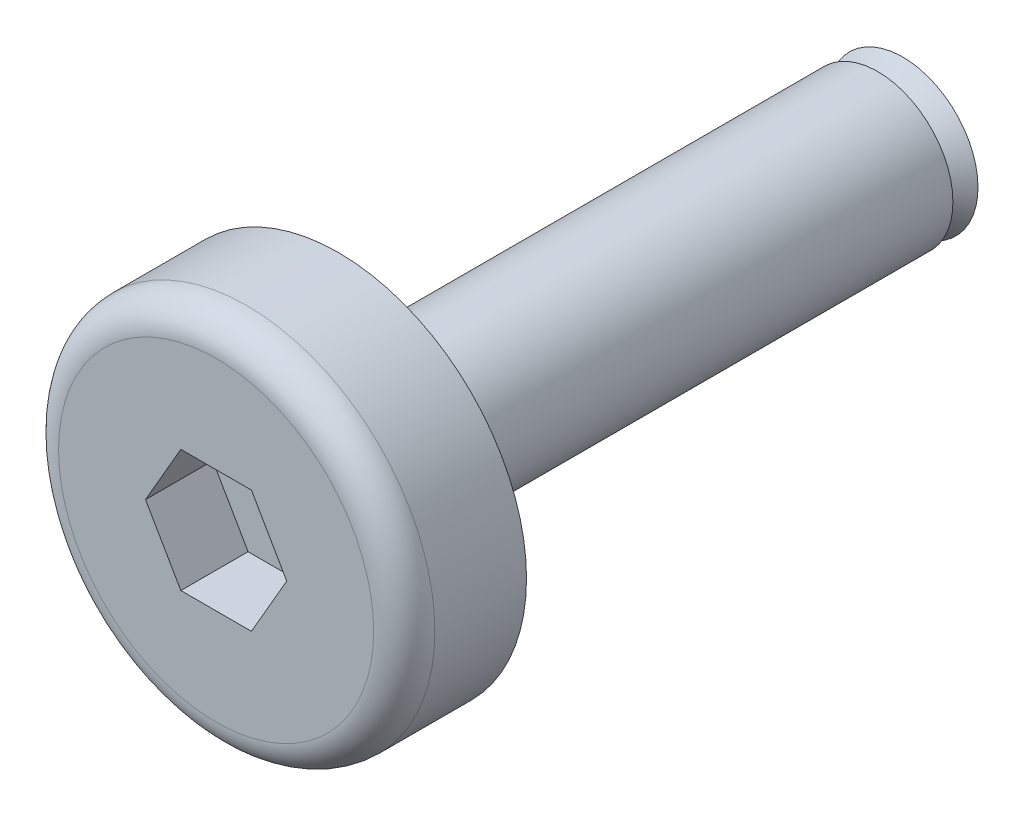
ISO-10303-21;
HEADER;
FILE_DESCRIPTION(('STEP AP214'),'2;1');
FILE_NAME('part.step','',(''),(''),'','','');
FILE_SCHEMA(('AUTOMOTIVE_DESIGN { 1 0 10303 214 1 1 1 1 }'));
ENDSEC;
DATA;
#1=APPLICATION_CONTEXT('core data for automotive mechanical design processes');
#2=APPLICATION_PROTOCOL_DEFINITION('international standard','automotive_design',2000,#1);
#3=PRODUCT_CONTEXT('',#1,'mechanical');
#4=PRODUCT('Part','Part','',(#3));
#5=PRODUCT_RELATED_PRODUCT_CATEGORY('part','',(#4));
#6=PRODUCT_DEFINITION_FORMATION('','',#4);
#7=PRODUCT_DEFINITION_CONTEXT('part definition',#1,'design');
#8=PRODUCT_DEFINITION('design','',#6,#7);
#9=PRODUCT_DEFINITION_SHAPE('','',#8);
#10=(LENGTH_UNIT() NAMED_UNIT(*) SI_UNIT(.MILLI.,.METRE.));
#11=(NAMED_UNIT(*) PLANE_ANGLE_UNIT() SI_UNIT($,.RADIAN.));
#12=(NAMED_UNIT(*) SI_UNIT($,.STERADIAN.) SOLID_ANGLE_UNIT());
#13=UNCERTAINTY_MEASURE_WITH_UNIT(LENGTH_MEASURE(1.E-05),#10,'distance_accuracy_value','');
#14=(GEOMETRIC_REPRESENTATION_CONTEXT(3) GLOBAL_UNCERTAINTY_ASSIGNED_CONTEXT((#13)) GLOBAL_UNIT_ASSIGNED_CONTEXT((#10,
#11,#12)) REPRESENTATION_CONTEXT('',''));
#15=CARTESIAN_POINT('',(0.,0.,0.));
#16=DIRECTION('',(0.,0.,1.));
#17=DIRECTION('',(1.,0.,0.));
#18=AXIS2_PLACEMENT_3D('',#15,#16,#17);
#19=CARTESIAN_POINT('',(0.,0.,-6.));
#20=DIRECTION('',(0.,0.,1.));
#21=DIRECTION('',(1.,0.,0.));
#22=AXIS2_PLACEMENT_3D('',#19,#20,#21);
#23=PLANE('',#22);
#24=CARTESIAN_POINT('',(0.,0.,-6.));
#25=DIRECTION('',(0.,0.,1.));
#26=DIRECTION('',(1.,0.,0.));
#27=AXIS2_PLACEMENT_3D('',#24,#25,#26);
#28=CIRCLE('',#27,0.8);
#29=CARTESIAN_POINT('',(0.8,0.,-6.));
#30=VERTEX_POINT('',#29);
#31=EDGE_CURVE('E9',#30,#30,#28,.T.);
#32=ORIENTED_EDGE('',*,*,#31,.F.);
#33=EDGE_LOOP('',(#32));
#34=FACE_BOUND('',#33,.T.);
#35=ADVANCED_FACE('F14',(#34),#23,.F.);
#36=CARTESIAN_POINT('',(0.,0.,-6.));
#37=DIRECTION('',(0.,0.,-1.));
#38=DIRECTION('',(1.,0.,0.));
#39=AXIS2_PLACEMENT_3D('',#36,#37,#38);
#40=CONICAL_SURFACE('',#39,0.8,0.785398163397);
#41=CARTESIAN_POINT('',(0.,0.,-5.733333333333));
#42=DIRECTION('',(0.,0.,1.));
#43=DIRECTION('',(1.,0.,0.));
#44=AXIS2_PLACEMENT_3D('',#41,#42,#43);
#45=CIRCLE('',#44,0.533333333333);
#46=CARTESIAN_POINT('',(0.533333333333,0.,-5.733333333333));
#47=VERTEX_POINT('',#46);
#48=EDGE_CURVE('E165',#47,#47,#45,.T.);
#49=ORIENTED_EDGE('',*,*,#48,.F.);
#50=DIRECTION('',(-0.707106781186548,0.,0.707106781186548));
#51=VECTOR('',#50,1.);
#52=CARTESIAN_POINT('',(0.8,0.,-6.));
#53=LINE('',#52,#51);
#54=EDGE_CURVE('E25',#30,#47,#53,.T.);
#55=ORIENTED_EDGE('',*,*,#54,.F.);
#56=ORIENTED_EDGE('',*,*,#31,.T.);
#57=ORIENTED_EDGE('',*,*,#54,.T.);
#58=EDGE_LOOP('',(#49,#55,#56,#57));
#59=FACE_BOUND('',#58,.T.);
#60=ADVANCED_FACE('F229',(#59),#40,.T.);
#61=CARTESIAN_POINT('',(0.,0.,0.585));
#62=DIRECTION('',(0.,0.,1.));
#63=DIRECTION('',(1.,0.,0.));
#64=AXIS2_PLACEMENT_3D('',#61,#62,#63);
#65=PLANE('',#64);
#66=DIRECTION('',(-0.50000000000019,0.866025403784329,0.));
#67=VECTOR('',#66,1.);
#68=CARTESIAN_POINT('',(0.750555349947,0.,0.585));
#69=LINE('',#68,#67);
#70=CARTESIAN_POINT('',(0.750555349947,0.,0.585));
#71=VERTEX_POINT('',#70);
#72=CARTESIAN_POINT('',(0.375277674973,0.65,0.585));
#73=VERTEX_POINT('',#72);
#74=EDGE_CURVE('E130',#71,#73,#69,.T.);
#75=ORIENTED_EDGE('',*,*,#74,.T.);
#76=DIRECTION('',(-1.,0.,0.));
#77=VECTOR('',#76,1.);
#78=CARTESIAN_POINT('',(0.375277674973,0.65,0.585));
#79=LINE('',#78,#77);
#80=CARTESIAN_POINT('',(-0.375277674973,0.65,0.585));
#81=VERTEX_POINT('',#80);
#82=EDGE_CURVE('E122',#73,#81,#79,.T.);
#83=ORIENTED_EDGE('',*,*,#82,.T.);
#84=DIRECTION('',(-0.50000000000019,-0.866025403784329,0.));
#85=VECTOR('',#84,1.);
#86=CARTESIAN_POINT('',(-0.375277674973,0.65,0.585));
#87=LINE('',#86,#85);
#88=CARTESIAN_POINT('',(-0.750555349947,0.,0.585));
#89=VERTEX_POINT('',#88);
#90=EDGE_CURVE('E107',#81,#89,#87,.T.);
#91=ORIENTED_EDGE('',*,*,#90,.T.);
#92=DIRECTION('',(0.50000000000019,-0.866025403784329,0.));
#93=VECTOR('',#92,1.);
#94=CARTESIAN_POINT('',(-0.750555349947,0.,0.585));
#95=LINE('',#94,#93);
#96=CARTESIAN_POINT('',(-0.375277674973,-0.65,0.585));
#97=VERTEX_POINT('',#96);
#98=EDGE_CURVE('E191',#89,#97,#95,.T.);
#99=ORIENTED_EDGE('',*,*,#98,.T.);
#100=DIRECTION('',(1.,0.,0.));
#101=VECTOR('',#100,1.);
#102=CARTESIAN_POINT('',(-0.375277674973,-0.65,0.585));
#103=LINE('',#102,#101);
#104=CARTESIAN_POINT('',(0.375277674973,-0.65,0.585));
#105=VERTEX_POINT('',#104);
#106=EDGE_CURVE('E180',#97,#105,#103,.T.);
#107=ORIENTED_EDGE('',*,*,#106,.T.);
#108=DIRECTION('',(0.50000000000019,0.866025403784329,0.));
#109=VECTOR('',#108,1.);
#110=CARTESIAN_POINT('',(0.375277674973,-0.65,0.585));
#111=LINE('',#110,#109);
#112=EDGE_CURVE('E175',#105,#71,#111,.T.);
#113=ORIENTED_EDGE('',*,*,#112,.T.);
#114=EDGE_LOOP('',(#75,#83,#91,#99,#107,#113));
#115=FACE_BOUND('',#114,.T.);
#116=ADVANCED_FACE('F128',(#115),#65,.T.);
#117=CARTESIAN_POINT('',(0.,0.,-5.733333333333));
#118=DIRECTION('',(0.,0.,1.));
#119=DIRECTION('',(1.,0.,0.));
#120=AXIS2_PLACEMENT_3D('',#117,#118,#119);
#121=PLANE('',#120);
#122=ORIENTED_EDGE('',*,*,#48,.T.);
#123=EDGE_LOOP('',(#122));
#124=FACE_BOUND('',#123,.T.);
#125=CARTESIAN_POINT('',(0.,0.,-5.733333333333));
#126=DIRECTION('',(0.,0.,1.));
#127=DIRECTION('',(1.,0.,0.));
#128=AXIS2_PLACEMENT_3D('',#125,#126,#127);
#129=CIRCLE('',#128,0.8);
#130=CARTESIAN_POINT('',(0.8,0.,-5.733333333333));
#131=VERTEX_POINT('',#130);
#132=EDGE_CURVE('E133',#131,#131,#129,.T.);
#133=ORIENTED_EDGE('',*,*,#132,.F.);
#134=EDGE_LOOP('',(#133));
#135=FACE_BOUND('',#134,.T.);
#136=ADVANCED_FACE('F217',(#124,#135),#121,.F.);
#137=CARTESIAN_POINT('',(0.750555349947,0.,0.585));
#138=DIRECTION('',(-0.866025403784329,-0.50000000000019,0.));
#139=DIRECTION('',(-0.50000000000019,0.866025403784329,0.));
#140=AXIS2_PLACEMENT_3D('',#137,#138,#139);
#141=PLANE('',#140);
#142=ORIENTED_EDGE('',*,*,#74,.F.);
#143=DIRECTION('',(0.,0.,1.));
#144=VECTOR('',#143,1.);
#145=CARTESIAN_POINT('',(0.750555349947,0.,0.585));
#146=LINE('',#145,#144);
#147=CARTESIAN_POINT('',(0.750555349947,0.,1.3));
#148=VERTEX_POINT('',#147);
#149=EDGE_CURVE('E173',#71,#148,#146,.T.);
#150=ORIENTED_EDGE('',*,*,#149,.T.);
#151=DIRECTION('',(0.50000000000019,-0.866025403784329,0.));
#152=VECTOR('',#151,1.);
#153=CARTESIAN_POINT('',(0.656735931203,0.1625,1.3));
#154=LINE('',#153,#152);
#155=CARTESIAN_POINT('',(0.375277674973,0.65,1.3));
#156=VERTEX_POINT('',#155);
#157=EDGE_CURVE('E158',#156,#148,#154,.T.);
#158=ORIENTED_EDGE('',*,*,#157,.F.);
#159=DIRECTION('',(0.,0.,1.));
#160=VECTOR('',#159,1.);
#161=CARTESIAN_POINT('',(0.375277674973,0.65,0.585));
#162=LINE('',#161,#160);
#163=EDGE_CURVE('E126',#73,#156,#162,.T.);
#164=ORIENTED_EDGE('',*,*,#163,.F.);
#165=EDGE_LOOP('',(#142,#150,#158,#164));
#166=FACE_BOUND('',#165,.T.);
#167=ADVANCED_FACE('F219',(#166),#141,.T.);
#168=CARTESIAN_POINT('',(0.375277674973,-0.65,0.585));
#169=DIRECTION('',(-0.866025403784329,0.50000000000019,0.));
#170=DIRECTION('',(0.,0.,1.));
#171=AXIS2_PLACEMENT_3D('',#168,#169,#170);
#172=PLANE('',#171);
#173=ORIENTED_EDGE('',*,*,#112,.F.);
#174=DIRECTION('',(0.,0.,1.));
#175=VECTOR('',#174,1.);
#176=CARTESIAN_POINT('',(0.375277674973,-0.65,0.585));
#177=LINE('',#176,#175);
#178=CARTESIAN_POINT('',(0.375277674973,-0.65,1.3));
#179=VERTEX_POINT('',#178);
#180=EDGE_CURVE('E184',#105,#179,#177,.T.);
#181=ORIENTED_EDGE('',*,*,#180,.T.);
#182=DIRECTION('',(-0.50000000000019,-0.866025403784329,0.));
#183=VECTOR('',#182,1.);
#184=CARTESIAN_POINT('',(0.469097093717,-0.4875,1.3));
#185=LINE('',#184,#183);
#186=EDGE_CURVE('E153',#148,#179,#185,.T.);
#187=ORIENTED_EDGE('',*,*,#186,.F.);
#188=ORIENTED_EDGE('',*,*,#149,.F.);
#189=EDGE_LOOP('',(#173,#181,#187,#188));
#190=FACE_BOUND('',#189,.T.);
#191=ADVANCED_FACE('F226',(#190),#172,.T.);
#192=CARTESIAN_POINT('',(-0.375277674973,-0.65,0.585));
#193=DIRECTION('',(0.,1.,0.));
#194=DIRECTION('',(1.,0.,0.));
#195=AXIS2_PLACEMENT_3D('',#192,#193,#194);
#196=PLANE('',#195);
#197=ORIENTED_EDGE('',*,*,#106,.F.);
#198=DIRECTION('',(0.,0.,1.));
#199=VECTOR('',#198,1.);
#200=CARTESIAN_POINT('',(-0.375277674973,-0.65,0.585));
#201=LINE('',#200,#199);
#202=CARTESIAN_POINT('',(-0.375277674973,-0.65,1.3));
#203=VERTEX_POINT('',#202);
#204=EDGE_CURVE('E185',#97,#203,#201,.T.);
#205=ORIENTED_EDGE('',*,*,#204,.T.);
#206=DIRECTION('',(-1.,0.,0.));
#207=VECTOR('',#206,1.);
#208=CARTESIAN_POINT('',(-0.187638837487,-0.65,1.3));
#209=LINE('',#208,#207);
#210=EDGE_CURVE('E157',#179,#203,#209,.T.);
#211=ORIENTED_EDGE('',*,*,#210,.F.);
#212=ORIENTED_EDGE('',*,*,#180,.F.);
#213=EDGE_LOOP('',(#197,#205,#211,#212));
#214=FACE_BOUND('',#213,.T.);
#215=ADVANCED_FACE('F245',(#214),#196,.T.);
#216=CARTESIAN_POINT('',(-0.750555349947,0.,0.585));
#217=DIRECTION('',(0.866025403784329,0.50000000000019,0.));
#218=DIRECTION('',(0.,0.,-1.));
#219=AXIS2_PLACEMENT_3D('',#216,#217,#218);
#220=PLANE('',#219);
#221=ORIENTED_EDGE('',*,*,#98,.F.);
#222=DIRECTION('',(0.,0.,1.));
#223=VECTOR('',#222,1.);
#224=CARTESIAN_POINT('',(-0.750555349947,0.,0.585));
#225=LINE('',#224,#223);
#226=CARTESIAN_POINT('',(-0.750555349947,0.,1.3));
#227=VERTEX_POINT('',#226);
#228=EDGE_CURVE('E18',#89,#227,#225,.T.);
#229=ORIENTED_EDGE('',*,*,#228,.T.);
#230=DIRECTION('',(-0.50000000000019,0.866025403784329,0.));
#231=VECTOR('',#230,1.);
#232=CARTESIAN_POINT('',(-0.656735931203,-0.1625,1.3));
#233=LINE('',#232,#231);
#234=EDGE_CURVE('E162',#203,#227,#233,.T.);
#235=ORIENTED_EDGE('',*,*,#234,.F.);
#236=ORIENTED_EDGE('',*,*,#204,.F.);
#237=EDGE_LOOP('',(#221,#229,#235,#236));
#238=FACE_BOUND('',#237,.T.);
#239=ADVANCED_FACE('F247',(#238),#220,.T.);
#240=CARTESIAN_POINT('',(-0.375277674973,0.65,0.585));
#241=DIRECTION('',(0.866025403784329,-0.50000000000019,0.));
#242=DIRECTION('',(0.,0.,-1.));
#243=AXIS2_PLACEMENT_3D('',#240,#241,#242);
#244=PLANE('',#243);
#245=ORIENTED_EDGE('',*,*,#90,.F.);
#246=DIRECTION('',(0.,0.,1.));
#247=VECTOR('',#246,1.);
#248=CARTESIAN_POINT('',(-0.375277674973,0.65,0.585));
#249=LINE('',#248,#247);
#250=CARTESIAN_POINT('',(-0.375277674973,0.65,1.3));
#251=VERTEX_POINT('',#250);
#252=EDGE_CURVE('E110',#81,#251,#249,.T.);
#253=ORIENTED_EDGE('',*,*,#252,.T.);
#254=DIRECTION('',(0.50000000000019,0.866025403784329,0.));
#255=VECTOR('',#254,1.);
#256=CARTESIAN_POINT('',(-0.469097093717,0.4875,1.3));
#257=LINE('',#256,#255);
#258=EDGE_CURVE('E144',#227,#251,#257,.T.);
#259=ORIENTED_EDGE('',*,*,#258,.F.);
#260=ORIENTED_EDGE('',*,*,#228,.F.);
#261=EDGE_LOOP('',(#245,#253,#259,#260));
#262=FACE_BOUND('',#261,.T.);
#263=ADVANCED_FACE('F16',(#262),#244,.T.);
#264=CARTESIAN_POINT('',(0.375277674973,0.65,0.585));
#265=DIRECTION('',(0.,-1.,0.));
#266=DIRECTION('',(0.,0.,-1.));
#267=AXIS2_PLACEMENT_3D('',#264,#265,#266);
#268=PLANE('',#267);
#269=ORIENTED_EDGE('',*,*,#82,.F.);
#270=ORIENTED_EDGE('',*,*,#163,.T.);
#271=DIRECTION('',(1.,0.,0.));
#272=VECTOR('',#271,1.);
#273=CARTESIAN_POINT('',(0.187638837487,0.65,1.3));
#274=LINE('',#273,#272);
#275=EDGE_CURVE('E124',#251,#156,#274,.T.);
#276=ORIENTED_EDGE('',*,*,#275,.F.);
#277=ORIENTED_EDGE('',*,*,#252,.F.);
#278=EDGE_LOOP('',(#269,#270,#276,#277));
#279=FACE_BOUND('',#278,.T.);
#280=ADVANCED_FACE('F120',(#279),#268,.T.);
#281=CARTESIAN_POINT('',(0.,0.,-5.733333333333));
#282=DIRECTION('',(0.,0.,1.));
#283=DIRECTION('',(1.,0.,0.));
#284=AXIS2_PLACEMENT_3D('',#281,#282,#283);
#285=CYLINDRICAL_SURFACE('',#284,0.8);
#286=CARTESIAN_POINT('',(0.,0.,0.));
#287=DIRECTION('',(0.,0.,1.));
#288=DIRECTION('',(1.,0.,0.));
#289=AXIS2_PLACEMENT_3D('',#286,#287,#288);
#290=CIRCLE('',#289,0.8);
#291=CARTESIAN_POINT('',(0.8,0.,0.));
#292=VERTEX_POINT('',#291);
#293=EDGE_CURVE('E171',#292,#292,#290,.T.);
#294=ORIENTED_EDGE('',*,*,#293,.F.);
#295=DIRECTION('',(0.,0.,1.));
#296=VECTOR('',#295,1.);
#297=CARTESIAN_POINT('',(0.8,0.,-5.733333333333));
#298=LINE('',#297,#296);
#299=EDGE_CURVE('E141',#131,#292,#298,.T.);
#300=ORIENTED_EDGE('',*,*,#299,.F.);
#301=ORIENTED_EDGE('',*,*,#132,.T.);
#302=ORIENTED_EDGE('',*,*,#299,.T.);
#303=EDGE_LOOP('',(#294,#300,#301,#302));
#304=FACE_BOUND('',#303,.T.);
#305=ADVANCED_FACE('F214',(#304),#285,.T.);
#306=CARTESIAN_POINT('',(0.,0.,1.3));
#307=DIRECTION('',(0.,0.,1.));
#308=DIRECTION('',(1.,0.,0.));
#309=AXIS2_PLACEMENT_3D('',#306,#307,#308);
#310=PLANE('',#309);
#311=ORIENTED_EDGE('',*,*,#275,.T.);
#312=ORIENTED_EDGE('',*,*,#157,.T.);
#313=ORIENTED_EDGE('',*,*,#186,.T.);
#314=ORIENTED_EDGE('',*,*,#210,.T.);
#315=ORIENTED_EDGE('',*,*,#234,.T.);
#316=ORIENTED_EDGE('',*,*,#258,.T.);
#317=EDGE_LOOP('',(#311,#312,#313,#314,#315,#316));
#318=FACE_BOUND('',#317,.T.);
#319=CARTESIAN_POINT('',(0.,0.,1.3));
#320=DIRECTION('',(0.,0.,1.));
#321=DIRECTION('',(1.,0.,0.));
#322=AXIS2_PLACEMENT_3D('',#319,#320,#321);
#323=CIRCLE('',#322,1.675);
#324=CARTESIAN_POINT('',(1.675,0.,1.3));
#325=VERTEX_POINT('',#324);
#326=EDGE_CURVE('E168',#325,#325,#323,.T.);
#327=ORIENTED_EDGE('',*,*,#326,.T.);
#328=EDGE_LOOP('',(#327));
#329=FACE_BOUND('',#328,.T.);
#330=ADVANCED_FACE('F280',(#318,#329),#310,.T.);
#331=CARTESIAN_POINT('',(0.,0.,0.));
#332=DIRECTION('',(0.,0.,1.));
#333=DIRECTION('',(1.,0.,0.));
#334=AXIS2_PLACEMENT_3D('',#331,#332,#333);
#335=PLANE('',#334);
#336=ORIENTED_EDGE('',*,*,#293,.T.);
#337=EDGE_LOOP('',(#336));
#338=FACE_BOUND('',#337,.T.);
#339=CARTESIAN_POINT('',(0.,0.,0.));
#340=DIRECTION('',(0.,0.,1.));
#341=DIRECTION('',(1.,0.,0.));
#342=AXIS2_PLACEMENT_3D('',#339,#340,#341);
#343=CIRCLE('',#342,2.);
#344=CARTESIAN_POINT('',(2.,0.,0.));
#345=VERTEX_POINT('',#344);
#346=EDGE_CURVE('E151',#345,#345,#343,.T.);
#347=ORIENTED_EDGE('',*,*,#346,.F.);
#348=EDGE_LOOP('',(#347));
#349=FACE_BOUND('',#348,.T.);
#350=ADVANCED_FACE('F210',(#338,#349),#335,.F.);
#351=CARTESIAN_POINT('',(0.,0.,0.975));
#352=DIRECTION('',(0.,0.,1.));
#353=DIRECTION('',(1.,0.,0.));
#354=AXIS2_PLACEMENT_3D('',#351,#352,#353);
#355=TOROIDAL_SURFACE('',#354,1.675,0.325);
#356=CARTESIAN_POINT('',(1.675,0.,0.975));
#357=DIRECTION('',(0.,-1.,0.));
#358=DIRECTION('',(1.,0.,0.));
#359=AXIS2_PLACEMENT_3D('',#356,#357,#358);
#360=CIRCLE('',#359,0.325);
#361=CARTESIAN_POINT('',(2.,0.,0.975));
#362=VERTEX_POINT('',#361);
#363=EDGE_CURVE('E172',#362,#325,#360,.T.);
#364=ORIENTED_EDGE('',*,*,#363,.F.);
#365=CARTESIAN_POINT('',(0.,0.,0.975));
#366=DIRECTION('',(0.,0.,1.));
#367=DIRECTION('',(1.,0.,0.));
#368=AXIS2_PLACEMENT_3D('',#365,#366,#367);
#369=CIRCLE('',#368,2.);
#370=EDGE_CURVE('E147',#362,#362,#369,.T.);
#371=ORIENTED_EDGE('',*,*,#370,.T.);
#372=ORIENTED_EDGE('',*,*,#363,.T.);
#373=ORIENTED_EDGE('',*,*,#326,.F.);
#374=EDGE_LOOP('',(#364,#371,#372,#373));
#375=FACE_BOUND('',#374,.T.);
#376=ADVANCED_FACE('F241',(#375),#355,.T.);
#377=CARTESIAN_POINT('',(0.,0.,0.));
#378=DIRECTION('',(0.,0.,1.));
#379=DIRECTION('',(1.,0.,0.));
#380=AXIS2_PLACEMENT_3D('',#377,#378,#379);
#381=CYLINDRICAL_SURFACE('',#380,2.);
#382=DIRECTION('',(0.,0.,1.));
#383=VECTOR('',#382,1.);
#384=CARTESIAN_POINT('',(2.,0.,0.));
#385=LINE('',#384,#383);
#386=EDGE_CURVE('E152',#345,#362,#385,.T.);
#387=ORIENTED_EDGE('',*,*,#386,.T.);
#388=ORIENTED_EDGE('',*,*,#370,.F.);
#389=ORIENTED_EDGE('',*,*,#386,.F.);
#390=ORIENTED_EDGE('',*,*,#346,.T.);
#391=EDGE_LOOP('',(#387,#388,#389,#390));
#392=FACE_BOUND('',#391,.T.);
#393=ADVANCED_FACE('F242',(#392),#381,.T.);
#394=CLOSED_SHELL('',(#35,#60,#116,#136,#167,#191,#215,#239,#263,#280,#305,#330,#350,#376,#393));
#395=MANIFOLD_SOLID_BREP('B1',#394);
#396=ADVANCED_BREP_SHAPE_REPRESENTATION('',(#18,#395),#14);
#397=SHAPE_DEFINITION_REPRESENTATION(#9,#396);
ENDSEC;
END-ISO-10303-21;
